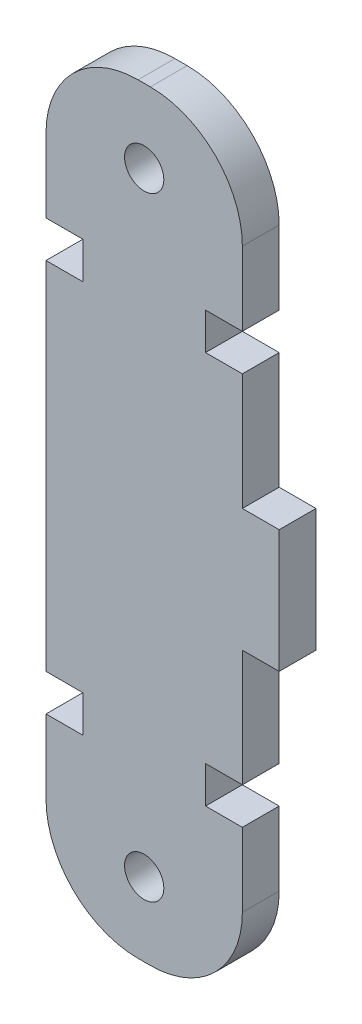
ISO-10303-21;
HEADER;
FILE_DESCRIPTION(('STEP AP214'),'2;1');
FILE_NAME('part.step','',(''),(''),'','','');
FILE_SCHEMA(('AUTOMOTIVE_DESIGN { 1 0 10303 214 1 1 1 1 }'));
ENDSEC;
DATA;
#1=APPLICATION_CONTEXT('core data for automotive mechanical design processes');
#2=APPLICATION_PROTOCOL_DEFINITION('international standard','automotive_design',2000,#1);
#3=PRODUCT_CONTEXT('',#1,'mechanical');
#4=PRODUCT('Part','Part','',(#3));
#5=PRODUCT_RELATED_PRODUCT_CATEGORY('part','',(#4));
#6=PRODUCT_DEFINITION_FORMATION('','',#4);
#7=PRODUCT_DEFINITION_CONTEXT('part definition',#1,'design');
#8=PRODUCT_DEFINITION('design','',#6,#7);
#9=PRODUCT_DEFINITION_SHAPE('','',#8);
#10=(LENGTH_UNIT() NAMED_UNIT(*) SI_UNIT(.MILLI.,.METRE.));
#11=(NAMED_UNIT(*) PLANE_ANGLE_UNIT() SI_UNIT($,.RADIAN.));
#12=(NAMED_UNIT(*) SI_UNIT($,.STERADIAN.) SOLID_ANGLE_UNIT());
#13=UNCERTAINTY_MEASURE_WITH_UNIT(LENGTH_MEASURE(1.E-05),#10,'distance_accuracy_value','');
#14=(GEOMETRIC_REPRESENTATION_CONTEXT(3) GLOBAL_UNCERTAINTY_ASSIGNED_CONTEXT((#13)) GLOBAL_UNIT_ASSIGNED_CONTEXT((#10,
#11,#12)) REPRESENTATION_CONTEXT('',''));
#15=CARTESIAN_POINT('',(0.,0.,0.));
#16=DIRECTION('',(0.,0.,1.));
#17=DIRECTION('',(1.,0.,0.));
#18=AXIS2_PLACEMENT_3D('',#15,#16,#17);
#19=CARTESIAN_POINT('',(0.,-14.5,3.));
#20=DIRECTION('',(0.,1.,0.));
#21=DIRECTION('',(0.,0.,1.));
#22=AXIS2_PLACEMENT_3D('',#19,#20,#21);
#23=PLANE('',#22);
#24=DIRECTION('',(1.,0.,0.));
#25=VECTOR('',#24,1.);
#26=CARTESIAN_POINT('',(0.,-14.5,0.));
#27=LINE('',#26,#25);
#28=CARTESIAN_POINT('',(-8.,-14.5,0.));
#29=VERTEX_POINT('',#28);
#30=CARTESIAN_POINT('',(-4.99999999999999,-14.5,0.));
#31=VERTEX_POINT('',#30);
#32=EDGE_CURVE('E237',#29,#31,#27,.T.);
#33=ORIENTED_EDGE('',*,*,#32,.T.);
#34=DIRECTION('',(0.,0.,-1.));
#35=VECTOR('',#34,1.);
#36=CARTESIAN_POINT('',(-4.99999999999999,-14.5,3.));
#37=LINE('',#36,#35);
#38=CARTESIAN_POINT('',(-4.99999999999999,-14.5,3.));
#39=VERTEX_POINT('',#38);
#40=EDGE_CURVE('E235',#39,#31,#37,.T.);
#41=ORIENTED_EDGE('',*,*,#40,.F.);
#42=DIRECTION('',(1.,0.,0.));
#43=VECTOR('',#42,1.);
#44=CARTESIAN_POINT('',(0.,-14.5,3.));
#45=LINE('',#44,#43);
#46=CARTESIAN_POINT('',(-8.,-14.5,3.));
#47=VERTEX_POINT('',#46);
#48=EDGE_CURVE('E219',#47,#39,#45,.T.);
#49=ORIENTED_EDGE('',*,*,#48,.F.);
#50=DIRECTION('',(0.,0.,-1.));
#51=VECTOR('',#50,1.);
#52=CARTESIAN_POINT('',(-8.,-14.5,3.));
#53=LINE('',#52,#51);
#54=EDGE_CURVE('E296',#47,#29,#53,.T.);
#55=ORIENTED_EDGE('',*,*,#54,.T.);
#56=EDGE_LOOP('',(#33,#41,#49,#55));
#57=FACE_BOUND('',#56,.T.);
#58=ADVANCED_FACE('F34',(#57),#23,.F.);
#59=CARTESIAN_POINT('',(-4.99999999999999,0.,3.));
#60=DIRECTION('',(-1.,0.,0.));
#61=DIRECTION('',(0.,0.,1.));
#62=AXIS2_PLACEMENT_3D('',#59,#60,#61);
#63=PLANE('',#62);
#64=DIRECTION('',(0.,1.,0.));
#65=VECTOR('',#64,1.);
#66=CARTESIAN_POINT('',(-4.99999999999999,0.,0.));
#67=LINE('',#66,#65);
#68=CARTESIAN_POINT('',(-4.99999999999999,-17.5,0.));
#69=VERTEX_POINT('',#68);
#70=EDGE_CURVE('E298',#69,#31,#67,.T.);
#71=ORIENTED_EDGE('',*,*,#70,.F.);
#72=DIRECTION('',(0.,0.,-1.));
#73=VECTOR('',#72,1.);
#74=CARTESIAN_POINT('',(-4.99999999999999,-17.5,3.));
#75=LINE('',#74,#73);
#76=CARTESIAN_POINT('',(-4.99999999999999,-17.5,3.));
#77=VERTEX_POINT('',#76);
#78=EDGE_CURVE('E242',#77,#69,#75,.T.);
#79=ORIENTED_EDGE('',*,*,#78,.F.);
#80=DIRECTION('',(0.,1.,0.));
#81=VECTOR('',#80,1.);
#82=CARTESIAN_POINT('',(-4.99999999999999,0.,3.));
#83=LINE('',#82,#81);
#84=EDGE_CURVE('E226',#77,#39,#83,.T.);
#85=ORIENTED_EDGE('',*,*,#84,.T.);
#86=ORIENTED_EDGE('',*,*,#40,.T.);
#87=EDGE_LOOP('',(#71,#79,#85,#86));
#88=FACE_BOUND('',#87,.T.);
#89=ADVANCED_FACE('F244',(#88),#63,.T.);
#90=CARTESIAN_POINT('',(0.,-17.5,3.));
#91=DIRECTION('',(0.,-1.,0.));
#92=DIRECTION('',(0.,0.,-1.));
#93=AXIS2_PLACEMENT_3D('',#90,#91,#92);
#94=PLANE('',#93);
#95=DIRECTION('',(-1.,0.,0.));
#96=VECTOR('',#95,1.);
#97=CARTESIAN_POINT('',(0.,-17.5,0.));
#98=LINE('',#97,#96);
#99=CARTESIAN_POINT('',(-8.,-17.5,0.));
#100=VERTEX_POINT('',#99);
#101=EDGE_CURVE('E301',#69,#100,#98,.T.);
#102=ORIENTED_EDGE('',*,*,#101,.T.);
#103=DIRECTION('',(0.,0.,-1.));
#104=VECTOR('',#103,1.);
#105=CARTESIAN_POINT('',(-8.,-17.5,3.));
#106=LINE('',#105,#104);
#107=CARTESIAN_POINT('',(-8.,-17.5,3.));
#108=VERTEX_POINT('',#107);
#109=EDGE_CURVE('E394',#108,#100,#106,.T.);
#110=ORIENTED_EDGE('',*,*,#109,.F.);
#111=DIRECTION('',(-1.,0.,0.));
#112=VECTOR('',#111,1.);
#113=CARTESIAN_POINT('',(0.,-17.5,3.));
#114=LINE('',#113,#112);
#115=EDGE_CURVE('E246',#77,#108,#114,.T.);
#116=ORIENTED_EDGE('',*,*,#115,.F.);
#117=ORIENTED_EDGE('',*,*,#78,.T.);
#118=EDGE_LOOP('',(#102,#110,#116,#117));
#119=FACE_BOUND('',#118,.T.);
#120=ADVANCED_FACE('F466',(#119),#94,.F.);
#121=CARTESIAN_POINT('',(-8.,0.,3.));
#122=DIRECTION('',(-1.,0.,0.));
#123=DIRECTION('',(0.,0.,1.));
#124=AXIS2_PLACEMENT_3D('',#121,#122,#123);
#125=PLANE('',#124);
#126=DIRECTION('',(0.,1.,0.));
#127=VECTOR('',#126,1.);
#128=CARTESIAN_POINT('',(-8.,0.,0.));
#129=LINE('',#128,#127);
#130=CARTESIAN_POINT('',(-8.,-23.5,0.));
#131=VERTEX_POINT('',#130);
#132=EDGE_CURVE('E304',#131,#100,#129,.T.);
#133=ORIENTED_EDGE('',*,*,#132,.F.);
#134=DIRECTION('',(0.,0.,-1.));
#135=VECTOR('',#134,1.);
#136=CARTESIAN_POINT('',(-8.,-23.5,3.));
#137=LINE('',#136,#135);
#138=CARTESIAN_POINT('',(-8.,-23.5,3.));
#139=VERTEX_POINT('',#138);
#140=EDGE_CURVE('E410',#131,#139,#137,.F.);
#141=ORIENTED_EDGE('',*,*,#140,.T.);
#142=DIRECTION('',(0.,1.,0.));
#143=VECTOR('',#142,1.);
#144=CARTESIAN_POINT('',(-8.,0.,3.));
#145=LINE('',#144,#143);
#146=EDGE_CURVE('E248',#139,#108,#145,.T.);
#147=ORIENTED_EDGE('',*,*,#146,.T.);
#148=ORIENTED_EDGE('',*,*,#109,.T.);
#149=EDGE_LOOP('',(#133,#141,#147,#148));
#150=FACE_BOUND('',#149,.T.);
#151=ADVANCED_FACE('F576',(#150),#125,.T.);
#152=CARTESIAN_POINT('',(0.,-31.,3.));
#153=DIRECTION('',(0.,-1.,0.));
#154=DIRECTION('',(1.,0.,0.));
#155=AXIS2_PLACEMENT_3D('',#152,#153,#154);
#156=PLANE('',#155);
#157=DIRECTION('',(-1.,0.,0.));
#158=VECTOR('',#157,1.);
#159=CARTESIAN_POINT('',(0.,-31.,3.));
#160=LINE('',#159,#158);
#161=CARTESIAN_POINT('',(0.499999999999998,-31.,3.));
#162=VERTEX_POINT('',#161);
#163=CARTESIAN_POINT('',(-0.5,-31.,3.));
#164=VERTEX_POINT('',#163);
#165=EDGE_CURVE('E253',#162,#164,#160,.T.);
#166=ORIENTED_EDGE('',*,*,#165,.T.);
#167=DIRECTION('',(0.,0.,-1.));
#168=VECTOR('',#167,1.);
#169=CARTESIAN_POINT('',(-0.5,-31.,3.));
#170=LINE('',#169,#168);
#171=CARTESIAN_POINT('',(-0.5,-31.,0.));
#172=VERTEX_POINT('',#171);
#173=EDGE_CURVE('E399',#164,#172,#170,.T.);
#174=ORIENTED_EDGE('',*,*,#173,.T.);
#175=DIRECTION('',(-1.,0.,0.));
#176=VECTOR('',#175,1.);
#177=CARTESIAN_POINT('',(0.,-31.,0.));
#178=LINE('',#177,#176);
#179=CARTESIAN_POINT('',(0.499999999999998,-31.,0.));
#180=VERTEX_POINT('',#179);
#181=EDGE_CURVE('E307',#180,#172,#178,.T.);
#182=ORIENTED_EDGE('',*,*,#181,.F.);
#183=DIRECTION('',(0.,0.,-1.));
#184=VECTOR('',#183,1.);
#185=CARTESIAN_POINT('',(0.499999999999998,-31.,3.));
#186=LINE('',#185,#184);
#187=EDGE_CURVE('E241',#180,#162,#186,.F.);
#188=ORIENTED_EDGE('',*,*,#187,.T.);
#189=EDGE_LOOP('',(#166,#174,#182,#188));
#190=FACE_BOUND('',#189,.T.);
#191=ADVANCED_FACE('F476',(#190),#156,.T.);
#192=CARTESIAN_POINT('',(8.,0.,3.));
#193=DIRECTION('',(-1.,0.,0.));
#194=DIRECTION('',(0.,-1.,0.));
#195=AXIS2_PLACEMENT_3D('',#192,#193,#194);
#196=PLANE('',#195);
#197=DIRECTION('',(0.,1.,0.));
#198=VECTOR('',#197,1.);
#199=CARTESIAN_POINT('',(8.,0.,3.));
#200=LINE('',#199,#198);
#201=CARTESIAN_POINT('',(8.,-23.5,3.));
#202=VERTEX_POINT('',#201);
#203=CARTESIAN_POINT('',(8.,-17.5,3.));
#204=VERTEX_POINT('',#203);
#205=EDGE_CURVE('E256',#202,#204,#200,.T.);
#206=ORIENTED_EDGE('',*,*,#205,.F.);
#207=DIRECTION('',(0.,0.,-1.));
#208=VECTOR('',#207,1.);
#209=CARTESIAN_POINT('',(8.,-23.5,0.));
#210=LINE('',#209,#208);
#211=CARTESIAN_POINT('',(8.,-23.5,0.));
#212=VERTEX_POINT('',#211);
#213=EDGE_CURVE('E419',#202,#212,#210,.T.);
#214=ORIENTED_EDGE('',*,*,#213,.T.);
#215=DIRECTION('',(0.,1.,0.));
#216=VECTOR('',#215,1.);
#217=CARTESIAN_POINT('',(8.,0.,0.));
#218=LINE('',#217,#216);
#219=CARTESIAN_POINT('',(8.,-17.5,0.));
#220=VERTEX_POINT('',#219);
#221=EDGE_CURVE('E310',#212,#220,#218,.T.);
#222=ORIENTED_EDGE('',*,*,#221,.T.);
#223=DIRECTION('',(0.,0.,-1.));
#224=VECTOR('',#223,1.);
#225=CARTESIAN_POINT('',(8.,-17.5,3.));
#226=LINE('',#225,#224);
#227=EDGE_CURVE('E391',#204,#220,#226,.T.);
#228=ORIENTED_EDGE('',*,*,#227,.F.);
#229=EDGE_LOOP('',(#206,#214,#222,#228));
#230=FACE_BOUND('',#229,.T.);
#231=ADVANCED_FACE('F486',(#230),#196,.F.);
#232=CARTESIAN_POINT('',(5.00000000000001,-17.5,0.));
#233=VERTEX_POINT('',#232);
#234=EDGE_CURVE('E305',#220,#233,#98,.T.);
#235=ORIENTED_EDGE('',*,*,#234,.T.);
#236=DIRECTION('',(0.,0.,-1.));
#237=VECTOR('',#236,1.);
#238=CARTESIAN_POINT('',(5.00000000000001,-17.5,3.));
#239=LINE('',#238,#237);
#240=CARTESIAN_POINT('',(5.00000000000001,-17.5,3.));
#241=VERTEX_POINT('',#240);
#242=EDGE_CURVE('E388',#241,#233,#239,.T.);
#243=ORIENTED_EDGE('',*,*,#242,.F.);
#244=EDGE_CURVE('E250',#204,#241,#114,.T.);
#245=ORIENTED_EDGE('',*,*,#244,.F.);
#246=ORIENTED_EDGE('',*,*,#227,.T.);
#247=EDGE_LOOP('',(#235,#243,#245,#246));
#248=FACE_BOUND('',#247,.T.);
#249=ADVANCED_FACE('F493',(#248),#94,.F.);
#250=CARTESIAN_POINT('',(5.,0.,3.));
#251=DIRECTION('',(-1.,0.,0.));
#252=DIRECTION('',(0.,-1.,0.));
#253=AXIS2_PLACEMENT_3D('',#250,#251,#252);
#254=PLANE('',#253);
#255=DIRECTION('',(0.,1.,0.));
#256=VECTOR('',#255,1.);
#257=CARTESIAN_POINT('',(5.,0.,0.));
#258=LINE('',#257,#256);
#259=CARTESIAN_POINT('',(5.00000000000001,-14.5,0.));
#260=VERTEX_POINT('',#259);
#261=EDGE_CURVE('E312',#233,#260,#258,.T.);
#262=ORIENTED_EDGE('',*,*,#261,.T.);
#263=DIRECTION('',(0.,0.,-1.));
#264=VECTOR('',#263,1.);
#265=CARTESIAN_POINT('',(5.00000000000001,-14.5,3.));
#266=LINE('',#265,#264);
#267=CARTESIAN_POINT('',(5.00000000000001,-14.5,3.));
#268=VERTEX_POINT('',#267);
#269=EDGE_CURVE('E385',#268,#260,#266,.T.);
#270=ORIENTED_EDGE('',*,*,#269,.F.);
#271=DIRECTION('',(0.,1.,0.));
#272=VECTOR('',#271,1.);
#273=CARTESIAN_POINT('',(5.,0.,3.));
#274=LINE('',#273,#272);
#275=EDGE_CURVE('E258',#241,#268,#274,.T.);
#276=ORIENTED_EDGE('',*,*,#275,.F.);
#277=ORIENTED_EDGE('',*,*,#242,.T.);
#278=EDGE_LOOP('',(#262,#270,#276,#277));
#279=FACE_BOUND('',#278,.T.);
#280=ADVANCED_FACE('F496',(#279),#254,.F.);
#281=CARTESIAN_POINT('',(8.,-14.5,0.));
#282=VERTEX_POINT('',#281);
#283=EDGE_CURVE('E299',#260,#282,#27,.T.);
#284=ORIENTED_EDGE('',*,*,#283,.T.);
#285=DIRECTION('',(0.,0.,-1.));
#286=VECTOR('',#285,1.);
#287=CARTESIAN_POINT('',(8.,-14.5,3.));
#288=LINE('',#287,#286);
#289=CARTESIAN_POINT('',(8.,-14.5,3.));
#290=VERTEX_POINT('',#289);
#291=EDGE_CURVE('E382',#290,#282,#288,.T.);
#292=ORIENTED_EDGE('',*,*,#291,.F.);
#293=EDGE_CURVE('E233',#268,#290,#45,.T.);
#294=ORIENTED_EDGE('',*,*,#293,.F.);
#295=ORIENTED_EDGE('',*,*,#269,.T.);
#296=EDGE_LOOP('',(#284,#292,#294,#295));
#297=FACE_BOUND('',#296,.T.);
#298=ADVANCED_FACE('F501',(#297),#23,.F.);
#299=CARTESIAN_POINT('',(8.,0.,3.));
#300=DIRECTION('',(-1.,0.,0.));
#301=DIRECTION('',(0.,0.,1.));
#302=AXIS2_PLACEMENT_3D('',#299,#300,#301);
#303=PLANE('',#302);
#304=DIRECTION('',(0.,1.,0.));
#305=VECTOR('',#304,1.);
#306=CARTESIAN_POINT('',(8.,0.,0.));
#307=LINE('',#306,#305);
#308=CARTESIAN_POINT('',(8.,-4.99999999999999,0.));
#309=VERTEX_POINT('',#308);
#310=EDGE_CURVE('E314',#282,#309,#307,.T.);
#311=ORIENTED_EDGE('',*,*,#310,.T.);
#312=DIRECTION('',(0.,0.,-1.));
#313=VECTOR('',#312,1.);
#314=CARTESIAN_POINT('',(8.,-4.99999999999999,3.));
#315=LINE('',#314,#313);
#316=CARTESIAN_POINT('',(8.,-4.99999999999999,3.));
#317=VERTEX_POINT('',#316);
#318=EDGE_CURVE('E380',#317,#309,#315,.T.);
#319=ORIENTED_EDGE('',*,*,#318,.F.);
#320=DIRECTION('',(0.,1.,0.));
#321=VECTOR('',#320,1.);
#322=CARTESIAN_POINT('',(8.,0.,3.));
#323=LINE('',#322,#321);
#324=EDGE_CURVE('E260',#290,#317,#323,.T.);
#325=ORIENTED_EDGE('',*,*,#324,.F.);
#326=ORIENTED_EDGE('',*,*,#291,.T.);
#327=EDGE_LOOP('',(#311,#319,#325,#326));
#328=FACE_BOUND('',#327,.T.);
#329=ADVANCED_FACE('F506',(#328),#303,.F.);
#330=CARTESIAN_POINT('',(0.,-4.99999999999999,3.));
#331=DIRECTION('',(0.,-1.,0.));
#332=DIRECTION('',(1.,0.,0.));
#333=AXIS2_PLACEMENT_3D('',#330,#331,#332);
#334=PLANE('',#333);
#335=DIRECTION('',(-1.,0.,0.));
#336=VECTOR('',#335,1.);
#337=CARTESIAN_POINT('',(0.,-4.99999999999999,0.));
#338=LINE('',#337,#336);
#339=CARTESIAN_POINT('',(11.,-4.99999999999999,0.));
#340=VERTEX_POINT('',#339);
#341=EDGE_CURVE('E317',#340,#309,#338,.T.);
#342=ORIENTED_EDGE('',*,*,#341,.F.);
#343=DIRECTION('',(0.,0.,-1.));
#344=VECTOR('',#343,1.);
#345=CARTESIAN_POINT('',(11.,-4.99999999999999,3.));
#346=LINE('',#345,#344);
#347=CARTESIAN_POINT('',(11.,-4.99999999999999,3.));
#348=VERTEX_POINT('',#347);
#349=EDGE_CURVE('E378',#348,#340,#346,.T.);
#350=ORIENTED_EDGE('',*,*,#349,.F.);
#351=DIRECTION('',(-1.,0.,0.));
#352=VECTOR('',#351,1.);
#353=CARTESIAN_POINT('',(0.,-4.99999999999999,3.));
#354=LINE('',#353,#352);
#355=EDGE_CURVE('E262',#348,#317,#354,.T.);
#356=ORIENTED_EDGE('',*,*,#355,.T.);
#357=ORIENTED_EDGE('',*,*,#318,.T.);
#358=EDGE_LOOP('',(#342,#350,#356,#357));
#359=FACE_BOUND('',#358,.T.);
#360=ADVANCED_FACE('F510',(#359),#334,.T.);
#361=CARTESIAN_POINT('',(11.,0.,3.));
#362=DIRECTION('',(-1.,0.,0.));
#363=DIRECTION('',(0.,-1.,0.));
#364=AXIS2_PLACEMENT_3D('',#361,#362,#363);
#365=PLANE('',#364);
#366=DIRECTION('',(0.,1.,0.));
#367=VECTOR('',#366,1.);
#368=CARTESIAN_POINT('',(11.,0.,0.));
#369=LINE('',#368,#367);
#370=CARTESIAN_POINT('',(11.,5.00000000000001,0.));
#371=VERTEX_POINT('',#370);
#372=EDGE_CURVE('E321',#340,#371,#369,.T.);
#373=ORIENTED_EDGE('',*,*,#372,.T.);
#374=DIRECTION('',(0.,0.,-1.));
#375=VECTOR('',#374,1.);
#376=CARTESIAN_POINT('',(11.,5.00000000000001,3.));
#377=LINE('',#376,#375);
#378=CARTESIAN_POINT('',(11.,5.00000000000001,3.));
#379=VERTEX_POINT('',#378);
#380=EDGE_CURVE('E375',#379,#371,#377,.T.);
#381=ORIENTED_EDGE('',*,*,#380,.F.);
#382=DIRECTION('',(0.,1.,0.));
#383=VECTOR('',#382,1.);
#384=CARTESIAN_POINT('',(11.,0.,3.));
#385=LINE('',#384,#383);
#386=EDGE_CURVE('E266',#348,#379,#385,.T.);
#387=ORIENTED_EDGE('',*,*,#386,.F.);
#388=ORIENTED_EDGE('',*,*,#349,.T.);
#389=EDGE_LOOP('',(#373,#381,#387,#388));
#390=FACE_BOUND('',#389,.T.);
#391=ADVANCED_FACE('F515',(#390),#365,.F.);
#392=CARTESIAN_POINT('',(0.,5.00000000000001,3.));
#393=DIRECTION('',(0.,-1.,0.));
#394=DIRECTION('',(0.,0.,-1.));
#395=AXIS2_PLACEMENT_3D('',#392,#393,#394);
#396=PLANE('',#395);
#397=DIRECTION('',(-1.,0.,0.));
#398=VECTOR('',#397,1.);
#399=CARTESIAN_POINT('',(0.,5.00000000000001,0.));
#400=LINE('',#399,#398);
#401=CARTESIAN_POINT('',(8.,5.00000000000001,0.));
#402=VERTEX_POINT('',#401);
#403=EDGE_CURVE('E323',#371,#402,#400,.T.);
#404=ORIENTED_EDGE('',*,*,#403,.T.);
#405=DIRECTION('',(0.,0.,-1.));
#406=VECTOR('',#405,1.);
#407=CARTESIAN_POINT('',(8.,5.00000000000001,3.));
#408=LINE('',#407,#406);
#409=CARTESIAN_POINT('',(8.,5.00000000000001,3.));
#410=VERTEX_POINT('',#409);
#411=EDGE_CURVE('E372',#410,#402,#408,.T.);
#412=ORIENTED_EDGE('',*,*,#411,.F.);
#413=DIRECTION('',(-1.,0.,0.));
#414=VECTOR('',#413,1.);
#415=CARTESIAN_POINT('',(0.,5.00000000000001,3.));
#416=LINE('',#415,#414);
#417=EDGE_CURVE('E268',#379,#410,#416,.T.);
#418=ORIENTED_EDGE('',*,*,#417,.F.);
#419=ORIENTED_EDGE('',*,*,#380,.T.);
#420=EDGE_LOOP('',(#404,#412,#418,#419));
#421=FACE_BOUND('',#420,.T.);
#422=ADVANCED_FACE('F522',(#421),#396,.F.);
#423=CARTESIAN_POINT('',(8.,14.5,0.));
#424=VERTEX_POINT('',#423);
#425=EDGE_CURVE('E318',#402,#424,#307,.T.);
#426=ORIENTED_EDGE('',*,*,#425,.T.);
#427=DIRECTION('',(0.,0.,-1.));
#428=VECTOR('',#427,1.);
#429=CARTESIAN_POINT('',(8.,14.5,3.));
#430=LINE('',#429,#428);
#431=CARTESIAN_POINT('',(8.,14.5,3.));
#432=VERTEX_POINT('',#431);
#433=EDGE_CURVE('E370',#432,#424,#430,.T.);
#434=ORIENTED_EDGE('',*,*,#433,.F.);
#435=EDGE_CURVE('E263',#410,#432,#323,.T.);
#436=ORIENTED_EDGE('',*,*,#435,.F.);
#437=ORIENTED_EDGE('',*,*,#411,.T.);
#438=EDGE_LOOP('',(#426,#434,#436,#437));
#439=FACE_BOUND('',#438,.T.);
#440=ADVANCED_FACE('F527',(#439),#303,.F.);
#441=CARTESIAN_POINT('',(0.,14.5,3.));
#442=DIRECTION('',(0.,1.,0.));
#443=DIRECTION('',(0.,0.,1.));
#444=AXIS2_PLACEMENT_3D('',#441,#442,#443);
#445=PLANE('',#444);
#446=DIRECTION('',(1.,0.,0.));
#447=VECTOR('',#446,1.);
#448=CARTESIAN_POINT('',(0.,14.5,0.));
#449=LINE('',#448,#447);
#450=CARTESIAN_POINT('',(5.,14.5,0.));
#451=VERTEX_POINT('',#450);
#452=EDGE_CURVE('E325',#451,#424,#449,.T.);
#453=ORIENTED_EDGE('',*,*,#452,.F.);
#454=DIRECTION('',(0.,0.,-1.));
#455=VECTOR('',#454,1.);
#456=CARTESIAN_POINT('',(5.,14.5,3.));
#457=LINE('',#456,#455);
#458=CARTESIAN_POINT('',(5.,14.5,3.));
#459=VERTEX_POINT('',#458);
#460=EDGE_CURVE('E368',#459,#451,#457,.T.);
#461=ORIENTED_EDGE('',*,*,#460,.F.);
#462=DIRECTION('',(1.,0.,0.));
#463=VECTOR('',#462,1.);
#464=CARTESIAN_POINT('',(0.,14.5,3.));
#465=LINE('',#464,#463);
#466=EDGE_CURVE('E270',#459,#432,#465,.T.);
#467=ORIENTED_EDGE('',*,*,#466,.T.);
#468=ORIENTED_EDGE('',*,*,#433,.T.);
#469=EDGE_LOOP('',(#453,#461,#467,#468));
#470=FACE_BOUND('',#469,.T.);
#471=ADVANCED_FACE('F530',(#470),#445,.T.);
#472=CARTESIAN_POINT('',(4.99999999999999,0.,3.));
#473=DIRECTION('',(1.,0.,0.));
#474=DIRECTION('',(0.,1.,0.));
#475=AXIS2_PLACEMENT_3D('',#472,#473,#474);
#476=PLANE('',#475);
#477=DIRECTION('',(0.,-1.,0.));
#478=VECTOR('',#477,1.);
#479=CARTESIAN_POINT('',(4.99999999999999,0.,0.));
#480=LINE('',#479,#478);
#481=CARTESIAN_POINT('',(5.,17.5,0.));
#482=VERTEX_POINT('',#481);
#483=EDGE_CURVE('E328',#482,#451,#480,.T.);
#484=ORIENTED_EDGE('',*,*,#483,.F.);
#485=DIRECTION('',(0.,0.,-1.));
#486=VECTOR('',#485,1.);
#487=CARTESIAN_POINT('',(5.,17.5,3.));
#488=LINE('',#487,#486);
#489=CARTESIAN_POINT('',(5.,17.5,3.));
#490=VERTEX_POINT('',#489);
#491=EDGE_CURVE('E366',#490,#482,#488,.T.);
#492=ORIENTED_EDGE('',*,*,#491,.F.);
#493=DIRECTION('',(0.,-1.,0.));
#494=VECTOR('',#493,1.);
#495=CARTESIAN_POINT('',(4.99999999999999,0.,3.));
#496=LINE('',#495,#494);
#497=EDGE_CURVE('E273',#490,#459,#496,.T.);
#498=ORIENTED_EDGE('',*,*,#497,.T.);
#499=ORIENTED_EDGE('',*,*,#460,.T.);
#500=EDGE_LOOP('',(#484,#492,#498,#499));
#501=FACE_BOUND('',#500,.T.);
#502=ADVANCED_FACE('F535',(#501),#476,.T.);
#503=CARTESIAN_POINT('',(0.,17.5,3.));
#504=DIRECTION('',(0.,-1.,0.));
#505=DIRECTION('',(0.,0.,-1.));
#506=AXIS2_PLACEMENT_3D('',#503,#504,#505);
#507=PLANE('',#506);
#508=DIRECTION('',(-1.,0.,0.));
#509=VECTOR('',#508,1.);
#510=CARTESIAN_POINT('',(0.,17.5,0.));
#511=LINE('',#510,#509);
#512=CARTESIAN_POINT('',(8.,17.5,0.));
#513=VERTEX_POINT('',#512);
#514=EDGE_CURVE('E332',#513,#482,#511,.T.);
#515=ORIENTED_EDGE('',*,*,#514,.F.);
#516=DIRECTION('',(0.,0.,-1.));
#517=VECTOR('',#516,1.);
#518=CARTESIAN_POINT('',(8.,17.5,3.));
#519=LINE('',#518,#517);
#520=CARTESIAN_POINT('',(8.,17.5,3.));
#521=VERTEX_POINT('',#520);
#522=EDGE_CURVE('E363',#521,#513,#519,.T.);
#523=ORIENTED_EDGE('',*,*,#522,.F.);
#524=DIRECTION('',(-1.,0.,0.));
#525=VECTOR('',#524,1.);
#526=CARTESIAN_POINT('',(0.,17.5,3.));
#527=LINE('',#526,#525);
#528=EDGE_CURVE('E277',#521,#490,#527,.T.);
#529=ORIENTED_EDGE('',*,*,#528,.T.);
#530=ORIENTED_EDGE('',*,*,#491,.T.);
#531=EDGE_LOOP('',(#515,#523,#529,#530));
#532=FACE_BOUND('',#531,.T.);
#533=ADVANCED_FACE('F538',(#532),#507,.T.);
#534=CARTESIAN_POINT('',(8.,0.,3.));
#535=DIRECTION('',(1.,0.,0.));
#536=DIRECTION('',(0.,1.,0.));
#537=AXIS2_PLACEMENT_3D('',#534,#535,#536);
#538=PLANE('',#537);
#539=DIRECTION('',(0.,-1.,0.));
#540=VECTOR('',#539,1.);
#541=CARTESIAN_POINT('',(8.,0.,0.));
#542=LINE('',#541,#540);
#543=CARTESIAN_POINT('',(8.,23.5,0.));
#544=VERTEX_POINT('',#543);
#545=EDGE_CURVE('E335',#544,#513,#542,.T.);
#546=ORIENTED_EDGE('',*,*,#545,.F.);
#547=DIRECTION('',(0.,0.,-1.));
#548=VECTOR('',#547,1.);
#549=CARTESIAN_POINT('',(8.,23.5,3.));
#550=LINE('',#549,#548);
#551=CARTESIAN_POINT('',(8.,23.5,3.));
#552=VERTEX_POINT('',#551);
#553=EDGE_CURVE('E11',#544,#552,#550,.F.);
#554=ORIENTED_EDGE('',*,*,#553,.T.);
#555=DIRECTION('',(0.,-1.,0.));
#556=VECTOR('',#555,1.);
#557=CARTESIAN_POINT('',(8.,0.,3.));
#558=LINE('',#557,#556);
#559=EDGE_CURVE('E280',#552,#521,#558,.T.);
#560=ORIENTED_EDGE('',*,*,#559,.T.);
#561=ORIENTED_EDGE('',*,*,#522,.T.);
#562=EDGE_LOOP('',(#546,#554,#560,#561));
#563=FACE_BOUND('',#562,.T.);
#564=ADVANCED_FACE('F543',(#563),#538,.T.);
#565=CARTESIAN_POINT('',(0.,31.,3.));
#566=DIRECTION('',(0.,-1.,0.));
#567=DIRECTION('',(1.,0.,0.));
#568=AXIS2_PLACEMENT_3D('',#565,#566,#567);
#569=PLANE('',#568);
#570=DIRECTION('',(-1.,0.,0.));
#571=VECTOR('',#570,1.);
#572=CARTESIAN_POINT('',(0.,31.,0.));
#573=LINE('',#572,#571);
#574=CARTESIAN_POINT('',(0.499999999999998,31.,0.));
#575=VERTEX_POINT('',#574);
#576=CARTESIAN_POINT('',(-0.5,31.,0.));
#577=VERTEX_POINT('',#576);
#578=EDGE_CURVE('E338',#575,#577,#573,.T.);
#579=ORIENTED_EDGE('',*,*,#578,.T.);
#580=DIRECTION('',(0.,0.,-1.));
#581=VECTOR('',#580,1.);
#582=CARTESIAN_POINT('',(-0.5,31.,3.));
#583=LINE('',#582,#581);
#584=CARTESIAN_POINT('',(-0.5,31.,3.));
#585=VERTEX_POINT('',#584);
#586=EDGE_CURVE('E42',#577,#585,#583,.F.);
#587=ORIENTED_EDGE('',*,*,#586,.T.);
#588=DIRECTION('',(-1.,0.,0.));
#589=VECTOR('',#588,1.);
#590=CARTESIAN_POINT('',(0.,31.,3.));
#591=LINE('',#590,#589);
#592=CARTESIAN_POINT('',(0.499999999999998,31.,3.));
#593=VERTEX_POINT('',#592);
#594=EDGE_CURVE('E283',#593,#585,#591,.T.);
#595=ORIENTED_EDGE('',*,*,#594,.F.);
#596=DIRECTION('',(0.,0.,-1.));
#597=VECTOR('',#596,1.);
#598=CARTESIAN_POINT('',(0.499999999999998,31.,0.));
#599=LINE('',#598,#597);
#600=EDGE_CURVE('E425',#593,#575,#599,.T.);
#601=ORIENTED_EDGE('',*,*,#600,.T.);
#602=EDGE_LOOP('',(#579,#587,#595,#601));
#603=FACE_BOUND('',#602,.T.);
#604=ADVANCED_FACE('F429',(#603),#569,.F.);
#605=CARTESIAN_POINT('',(-8.,0.,3.));
#606=DIRECTION('',(1.,0.,0.));
#607=DIRECTION('',(0.,0.,-1.));
#608=AXIS2_PLACEMENT_3D('',#605,#606,#607);
#609=PLANE('',#608);
#610=DIRECTION('',(0.,-1.,0.));
#611=VECTOR('',#610,1.);
#612=CARTESIAN_POINT('',(-8.,0.,3.));
#613=LINE('',#612,#611);
#614=CARTESIAN_POINT('',(-8.,23.5,3.));
#615=VERTEX_POINT('',#614);
#616=CARTESIAN_POINT('',(-8.,17.5,3.));
#617=VERTEX_POINT('',#616);
#618=EDGE_CURVE('E285',#615,#617,#613,.T.);
#619=ORIENTED_EDGE('',*,*,#618,.F.);
#620=DIRECTION('',(0.,0.,-1.));
#621=VECTOR('',#620,1.);
#622=CARTESIAN_POINT('',(-8.,23.5,3.));
#623=LINE('',#622,#621);
#624=CARTESIAN_POINT('',(-8.,23.5,0.));
#625=VERTEX_POINT('',#624);
#626=EDGE_CURVE('E422',#615,#625,#623,.T.);
#627=ORIENTED_EDGE('',*,*,#626,.T.);
#628=DIRECTION('',(0.,-1.,0.));
#629=VECTOR('',#628,1.);
#630=CARTESIAN_POINT('',(-8.,0.,0.));
#631=LINE('',#630,#629);
#632=CARTESIAN_POINT('',(-8.,17.5,0.));
#633=VERTEX_POINT('',#632);
#634=EDGE_CURVE('E340',#625,#633,#631,.T.);
#635=ORIENTED_EDGE('',*,*,#634,.T.);
#636=DIRECTION('',(0.,0.,-1.));
#637=VECTOR('',#636,1.);
#638=CARTESIAN_POINT('',(-8.,17.5,3.));
#639=LINE('',#638,#637);
#640=EDGE_CURVE('E360',#617,#633,#639,.T.);
#641=ORIENTED_EDGE('',*,*,#640,.F.);
#642=EDGE_LOOP('',(#619,#627,#635,#641));
#643=FACE_BOUND('',#642,.T.);
#644=ADVANCED_FACE('F442',(#643),#609,.F.);
#645=CARTESIAN_POINT('',(-5.,17.5,0.));
#646=VERTEX_POINT('',#645);
#647=EDGE_CURVE('E336',#646,#633,#511,.T.);
#648=ORIENTED_EDGE('',*,*,#647,.F.);
#649=DIRECTION('',(0.,0.,-1.));
#650=VECTOR('',#649,1.);
#651=CARTESIAN_POINT('',(-5.,17.5,3.));
#652=LINE('',#651,#650);
#653=CARTESIAN_POINT('',(-5.,17.5,3.));
#654=VERTEX_POINT('',#653);
#655=EDGE_CURVE('E358',#654,#646,#652,.T.);
#656=ORIENTED_EDGE('',*,*,#655,.F.);
#657=EDGE_CURVE('E281',#654,#617,#527,.T.);
#658=ORIENTED_EDGE('',*,*,#657,.T.);
#659=ORIENTED_EDGE('',*,*,#640,.T.);
#660=EDGE_LOOP('',(#648,#656,#658,#659));
#661=FACE_BOUND('',#660,.T.);
#662=ADVANCED_FACE('F450',(#661),#507,.T.);
#663=CARTESIAN_POINT('',(-5.,0.,3.));
#664=DIRECTION('',(1.,0.,0.));
#665=DIRECTION('',(0.,0.,-1.));
#666=AXIS2_PLACEMENT_3D('',#663,#664,#665);
#667=PLANE('',#666);
#668=DIRECTION('',(0.,-1.,0.));
#669=VECTOR('',#668,1.);
#670=CARTESIAN_POINT('',(-5.,0.,0.));
#671=LINE('',#670,#669);
#672=CARTESIAN_POINT('',(-5.,14.5,0.));
#673=VERTEX_POINT('',#672);
#674=EDGE_CURVE('E342',#646,#673,#671,.T.);
#675=ORIENTED_EDGE('',*,*,#674,.T.);
#676=DIRECTION('',(0.,0.,-1.));
#677=VECTOR('',#676,1.);
#678=CARTESIAN_POINT('',(-5.,14.5,3.));
#679=LINE('',#678,#677);
#680=CARTESIAN_POINT('',(-5.,14.5,3.));
#681=VERTEX_POINT('',#680);
#682=EDGE_CURVE('E356',#681,#673,#679,.T.);
#683=ORIENTED_EDGE('',*,*,#682,.F.);
#684=DIRECTION('',(0.,-1.,0.));
#685=VECTOR('',#684,1.);
#686=CARTESIAN_POINT('',(-5.,0.,3.));
#687=LINE('',#686,#685);
#688=EDGE_CURVE('E287',#654,#681,#687,.T.);
#689=ORIENTED_EDGE('',*,*,#688,.F.);
#690=ORIENTED_EDGE('',*,*,#655,.T.);
#691=EDGE_LOOP('',(#675,#683,#689,#690));
#692=FACE_BOUND('',#691,.T.);
#693=ADVANCED_FACE('F453',(#692),#667,.F.);
#694=CARTESIAN_POINT('',(-8.,14.5,0.));
#695=VERTEX_POINT('',#694);
#696=EDGE_CURVE('E329',#695,#673,#449,.T.);
#697=ORIENTED_EDGE('',*,*,#696,.F.);
#698=DIRECTION('',(0.,0.,-1.));
#699=VECTOR('',#698,1.);
#700=CARTESIAN_POINT('',(-8.,14.5,3.));
#701=LINE('',#700,#699);
#702=CARTESIAN_POINT('',(-8.,14.5,3.));
#703=VERTEX_POINT('',#702);
#704=EDGE_CURVE('E354',#703,#695,#701,.T.);
#705=ORIENTED_EDGE('',*,*,#704,.F.);
#706=EDGE_CURVE('E274',#703,#681,#465,.T.);
#707=ORIENTED_EDGE('',*,*,#706,.T.);
#708=ORIENTED_EDGE('',*,*,#682,.T.);
#709=EDGE_LOOP('',(#697,#705,#707,#708));
#710=FACE_BOUND('',#709,.T.);
#711=ADVANCED_FACE('F458',(#710),#445,.T.);
#712=CARTESIAN_POINT('',(0.,25.,3.));
#713=DIRECTION('',(0.,0.,-1.));
#714=DIRECTION('',(-1.,0.,0.));
#715=AXIS2_PLACEMENT_3D('',#712,#713,#714);
#716=CYLINDRICAL_SURFACE('',#715,1.6);
#717=CARTESIAN_POINT('',(0.,25.,3.));
#718=DIRECTION('',(0.,0.,1.));
#719=DIRECTION('',(1.,0.,0.));
#720=AXIS2_PLACEMENT_3D('',#717,#718,#719);
#721=CIRCLE('',#720,1.6);
#722=CARTESIAN_POINT('',(1.6,25.,3.));
#723=VERTEX_POINT('',#722);
#724=EDGE_CURVE('E290',#723,#723,#721,.T.);
#725=ORIENTED_EDGE('',*,*,#724,.T.);
#726=EDGE_LOOP('',(#725));
#727=FACE_BOUND('',#726,.T.);
#728=CARTESIAN_POINT('',(0.,25.,0.));
#729=DIRECTION('',(0.,0.,1.));
#730=DIRECTION('',(1.,0.,0.));
#731=AXIS2_PLACEMENT_3D('',#728,#729,#730);
#732=CIRCLE('',#731,1.6);
#733=CARTESIAN_POINT('',(1.6,25.,0.));
#734=VERTEX_POINT('',#733);
#735=EDGE_CURVE('E348',#734,#734,#732,.T.);
#736=ORIENTED_EDGE('',*,*,#735,.F.);
#737=EDGE_LOOP('',(#736));
#738=FACE_BOUND('',#737,.T.);
#739=ADVANCED_FACE('F685',(#727,#738),#716,.F.);
#740=CARTESIAN_POINT('',(-8.,0.,3.));
#741=DIRECTION('',(-1.,0.,0.));
#742=DIRECTION('',(0.,0.,1.));
#743=AXIS2_PLACEMENT_3D('',#740,#741,#742);
#744=PLANE('',#743);
#745=DIRECTION('',(0.,1.,0.));
#746=VECTOR('',#745,1.);
#747=CARTESIAN_POINT('',(-8.,0.,0.));
#748=LINE('',#747,#746);
#749=EDGE_CURVE('E345',#29,#695,#748,.T.);
#750=ORIENTED_EDGE('',*,*,#749,.F.);
#751=ORIENTED_EDGE('',*,*,#54,.F.);
#752=DIRECTION('',(0.,1.,0.));
#753=VECTOR('',#752,1.);
#754=CARTESIAN_POINT('',(-8.,0.,3.));
#755=LINE('',#754,#753);
#756=EDGE_CURVE('E229',#47,#703,#755,.T.);
#757=ORIENTED_EDGE('',*,*,#756,.T.);
#758=ORIENTED_EDGE('',*,*,#704,.T.);
#759=EDGE_LOOP('',(#750,#751,#757,#758));
#760=FACE_BOUND('',#759,.T.);
#761=ADVANCED_FACE('F461',(#760),#744,.T.);
#762=CARTESIAN_POINT('',(0.,-25.,3.));
#763=DIRECTION('',(0.,0.,-1.));
#764=DIRECTION('',(-1.,0.,0.));
#765=AXIS2_PLACEMENT_3D('',#762,#763,#764);
#766=CYLINDRICAL_SURFACE('',#765,1.6);
#767=CARTESIAN_POINT('',(0.,-25.,3.));
#768=DIRECTION('',(0.,0.,1.));
#769=DIRECTION('',(1.,0.,0.));
#770=AXIS2_PLACEMENT_3D('',#767,#768,#769);
#771=CIRCLE('',#770,1.6);
#772=CARTESIAN_POINT('',(1.6,-25.,3.));
#773=VERTEX_POINT('',#772);
#774=EDGE_CURVE('E293',#773,#773,#771,.T.);
#775=ORIENTED_EDGE('',*,*,#774,.T.);
#776=EDGE_LOOP('',(#775));
#777=FACE_BOUND('',#776,.T.);
#778=CARTESIAN_POINT('',(0.,-25.,0.));
#779=DIRECTION('',(0.,0.,1.));
#780=DIRECTION('',(1.,0.,0.));
#781=AXIS2_PLACEMENT_3D('',#778,#779,#780);
#782=CIRCLE('',#781,1.6);
#783=CARTESIAN_POINT('',(1.6,-25.,0.));
#784=VERTEX_POINT('',#783);
#785=EDGE_CURVE('E231',#784,#784,#782,.T.);
#786=ORIENTED_EDGE('',*,*,#785,.F.);
#787=EDGE_LOOP('',(#786));
#788=FACE_BOUND('',#787,.T.);
#789=ADVANCED_FACE('F622',(#777,#788),#766,.F.);
#790=CARTESIAN_POINT('',(0.,0.,3.));
#791=DIRECTION('',(0.,0.,1.));
#792=DIRECTION('',(1.,0.,0.));
#793=AXIS2_PLACEMENT_3D('',#790,#791,#792);
#794=PLANE('',#793);
#795=ORIENTED_EDGE('',*,*,#146,.F.);
#796=CARTESIAN_POINT('',(-0.499999999999999,-23.5,3.));
#797=DIRECTION('',(0.,0.,1.));
#798=DIRECTION('',(1.,0.,0.));
#799=AXIS2_PLACEMENT_3D('',#796,#797,#798);
#800=CIRCLE('',#799,7.5);
#801=EDGE_CURVE('E417',#139,#164,#800,.T.);
#802=ORIENTED_EDGE('',*,*,#801,.T.);
#803=ORIENTED_EDGE('',*,*,#165,.F.);
#804=CARTESIAN_POINT('',(0.499999999999999,-23.5,3.));
#805=DIRECTION('',(0.,0.,1.));
#806=DIRECTION('',(1.,0.,0.));
#807=AXIS2_PLACEMENT_3D('',#804,#805,#806);
#808=CIRCLE('',#807,7.5);
#809=EDGE_CURVE('E415',#162,#202,#808,.T.);
#810=ORIENTED_EDGE('',*,*,#809,.T.);
#811=ORIENTED_EDGE('',*,*,#205,.T.);
#812=ORIENTED_EDGE('',*,*,#244,.T.);
#813=ORIENTED_EDGE('',*,*,#275,.T.);
#814=ORIENTED_EDGE('',*,*,#293,.T.);
#815=ORIENTED_EDGE('',*,*,#324,.T.);
#816=ORIENTED_EDGE('',*,*,#355,.F.);
#817=ORIENTED_EDGE('',*,*,#386,.T.);
#818=ORIENTED_EDGE('',*,*,#417,.T.);
#819=ORIENTED_EDGE('',*,*,#435,.T.);
#820=ORIENTED_EDGE('',*,*,#466,.F.);
#821=ORIENTED_EDGE('',*,*,#497,.F.);
#822=ORIENTED_EDGE('',*,*,#528,.F.);
#823=ORIENTED_EDGE('',*,*,#559,.F.);
#824=CARTESIAN_POINT('',(0.499999999999999,23.5,3.));
#825=DIRECTION('',(0.,0.,1.));
#826=DIRECTION('',(1.,0.,0.));
#827=AXIS2_PLACEMENT_3D('',#824,#825,#826);
#828=CIRCLE('',#827,7.5);
#829=EDGE_CURVE('E412',#552,#593,#828,.T.);
#830=ORIENTED_EDGE('',*,*,#829,.T.);
#831=ORIENTED_EDGE('',*,*,#594,.T.);
#832=CARTESIAN_POINT('',(-0.499999999999999,23.5,3.));
#833=DIRECTION('',(0.,0.,1.));
#834=DIRECTION('',(1.,0.,0.));
#835=AXIS2_PLACEMENT_3D('',#832,#833,#834);
#836=CIRCLE('',#835,7.5);
#837=EDGE_CURVE('E49',#585,#615,#836,.T.);
#838=ORIENTED_EDGE('',*,*,#837,.T.);
#839=ORIENTED_EDGE('',*,*,#618,.T.);
#840=ORIENTED_EDGE('',*,*,#657,.F.);
#841=ORIENTED_EDGE('',*,*,#688,.T.);
#842=ORIENTED_EDGE('',*,*,#706,.F.);
#843=ORIENTED_EDGE('',*,*,#756,.F.);
#844=ORIENTED_EDGE('',*,*,#48,.T.);
#845=ORIENTED_EDGE('',*,*,#84,.F.);
#846=ORIENTED_EDGE('',*,*,#115,.T.);
#847=EDGE_LOOP('',(#795,#802,#803,#810,#811,#812,#813,#814,#815,#816,#817,#818,#819,#820,#821,
#822,#823,#830,#831,#838,#839,#840,#841,#842,#843,#844,#845,#846));
#848=FACE_BOUND('',#847,.T.);
#849=ORIENTED_EDGE('',*,*,#724,.F.);
#850=EDGE_LOOP('',(#849));
#851=FACE_BOUND('',#850,.T.);
#852=ORIENTED_EDGE('',*,*,#774,.F.);
#853=EDGE_LOOP('',(#852));
#854=FACE_BOUND('',#853,.T.);
#855=ADVANCED_FACE('F222',(#848,#851,#854),#794,.T.);
#856=CARTESIAN_POINT('',(0.,0.,0.));
#857=DIRECTION('',(0.,0.,1.));
#858=DIRECTION('',(1.,0.,0.));
#859=AXIS2_PLACEMENT_3D('',#856,#857,#858);
#860=PLANE('',#859);
#861=ORIENTED_EDGE('',*,*,#181,.T.);
#862=CARTESIAN_POINT('',(-0.499999999999999,-23.5,0.));
#863=DIRECTION('',(0.,0.,1.));
#864=DIRECTION('',(1.,0.,0.));
#865=AXIS2_PLACEMENT_3D('',#862,#863,#864);
#866=CIRCLE('',#865,7.5);
#867=EDGE_CURVE('E408',#172,#131,#866,.F.);
#868=ORIENTED_EDGE('',*,*,#867,.T.);
#869=ORIENTED_EDGE('',*,*,#132,.T.);
#870=ORIENTED_EDGE('',*,*,#101,.F.);
#871=ORIENTED_EDGE('',*,*,#70,.T.);
#872=ORIENTED_EDGE('',*,*,#32,.F.);
#873=ORIENTED_EDGE('',*,*,#749,.T.);
#874=ORIENTED_EDGE('',*,*,#696,.T.);
#875=ORIENTED_EDGE('',*,*,#674,.F.);
#876=ORIENTED_EDGE('',*,*,#647,.T.);
#877=ORIENTED_EDGE('',*,*,#634,.F.);
#878=CARTESIAN_POINT('',(-0.499999999999999,23.5,0.));
#879=DIRECTION('',(0.,0.,1.));
#880=DIRECTION('',(1.,0.,0.));
#881=AXIS2_PLACEMENT_3D('',#878,#879,#880);
#882=CIRCLE('',#881,7.5);
#883=EDGE_CURVE('E404',#625,#577,#882,.F.);
#884=ORIENTED_EDGE('',*,*,#883,.T.);
#885=ORIENTED_EDGE('',*,*,#578,.F.);
#886=CARTESIAN_POINT('',(0.499999999999999,23.5,0.));
#887=DIRECTION('',(0.,0.,1.));
#888=DIRECTION('',(1.,0.,0.));
#889=AXIS2_PLACEMENT_3D('',#886,#887,#888);
#890=CIRCLE('',#889,7.5);
#891=EDGE_CURVE('E402',#575,#544,#890,.F.);
#892=ORIENTED_EDGE('',*,*,#891,.T.);
#893=ORIENTED_EDGE('',*,*,#545,.T.);
#894=ORIENTED_EDGE('',*,*,#514,.T.);
#895=ORIENTED_EDGE('',*,*,#483,.T.);
#896=ORIENTED_EDGE('',*,*,#452,.T.);
#897=ORIENTED_EDGE('',*,*,#425,.F.);
#898=ORIENTED_EDGE('',*,*,#403,.F.);
#899=ORIENTED_EDGE('',*,*,#372,.F.);
#900=ORIENTED_EDGE('',*,*,#341,.T.);
#901=ORIENTED_EDGE('',*,*,#310,.F.);
#902=ORIENTED_EDGE('',*,*,#283,.F.);
#903=ORIENTED_EDGE('',*,*,#261,.F.);
#904=ORIENTED_EDGE('',*,*,#234,.F.);
#905=ORIENTED_EDGE('',*,*,#221,.F.);
#906=CARTESIAN_POINT('',(0.499999999999999,-23.5,0.));
#907=DIRECTION('',(0.,0.,1.));
#908=DIRECTION('',(1.,0.,0.));
#909=AXIS2_PLACEMENT_3D('',#906,#907,#908);
#910=CIRCLE('',#909,7.5);
#911=EDGE_CURVE('E406',#212,#180,#910,.F.);
#912=ORIENTED_EDGE('',*,*,#911,.T.);
#913=EDGE_LOOP('',(#861,#868,#869,#870,#871,#872,#873,#874,#875,#876,#877,#884,#885,#892,#893,
#894,#895,#896,#897,#898,#899,#900,#901,#902,#903,#904,#905,#912));
#914=FACE_BOUND('',#913,.T.);
#915=ORIENTED_EDGE('',*,*,#735,.T.);
#916=EDGE_LOOP('',(#915));
#917=FACE_BOUND('',#916,.T.);
#918=ORIENTED_EDGE('',*,*,#785,.T.);
#919=EDGE_LOOP('',(#918));
#920=FACE_BOUND('',#919,.T.);
#921=ADVANCED_FACE('F433',(#914,#917,#920),#860,.F.);
#922=CARTESIAN_POINT('',(-0.499999999999999,-23.5,3.));
#923=DIRECTION('',(0.,0.,-1.));
#924=DIRECTION('',(-1.,0.,0.));
#925=AXIS2_PLACEMENT_3D('',#922,#923,#924);
#926=CYLINDRICAL_SURFACE('',#925,7.5);
#927=ORIENTED_EDGE('',*,*,#801,.F.);
#928=ORIENTED_EDGE('',*,*,#140,.F.);
#929=ORIENTED_EDGE('',*,*,#867,.F.);
#930=ORIENTED_EDGE('',*,*,#173,.F.);
#931=EDGE_LOOP('',(#927,#928,#929,#930));
#932=FACE_BOUND('',#931,.T.);
#933=ADVANCED_FACE('F473',(#932),#926,.T.);
#934=CARTESIAN_POINT('',(0.499999999999999,-23.5,3.));
#935=DIRECTION('',(0.,0.,1.));
#936=DIRECTION('',(1.,0.,0.));
#937=AXIS2_PLACEMENT_3D('',#934,#935,#936);
#938=CYLINDRICAL_SURFACE('',#937,7.5);
#939=ORIENTED_EDGE('',*,*,#809,.F.);
#940=ORIENTED_EDGE('',*,*,#187,.F.);
#941=ORIENTED_EDGE('',*,*,#911,.F.);
#942=ORIENTED_EDGE('',*,*,#213,.F.);
#943=EDGE_LOOP('',(#939,#940,#941,#942));
#944=FACE_BOUND('',#943,.T.);
#945=ADVANCED_FACE('F483',(#944),#938,.T.);
#946=CARTESIAN_POINT('',(-0.499999999999999,23.5,3.));
#947=DIRECTION('',(0.,0.,-1.));
#948=DIRECTION('',(-1.,0.,0.));
#949=AXIS2_PLACEMENT_3D('',#946,#947,#948);
#950=CYLINDRICAL_SURFACE('',#949,7.5);
#951=ORIENTED_EDGE('',*,*,#837,.F.);
#952=ORIENTED_EDGE('',*,*,#586,.F.);
#953=ORIENTED_EDGE('',*,*,#883,.F.);
#954=ORIENTED_EDGE('',*,*,#626,.F.);
#955=EDGE_LOOP('',(#951,#952,#953,#954));
#956=FACE_BOUND('',#955,.T.);
#957=ADVANCED_FACE('F440',(#956),#950,.T.);
#958=CARTESIAN_POINT('',(0.499999999999999,23.5,3.));
#959=DIRECTION('',(0.,0.,1.));
#960=DIRECTION('',(1.,0.,0.));
#961=AXIS2_PLACEMENT_3D('',#958,#959,#960);
#962=CYLINDRICAL_SURFACE('',#961,7.5);
#963=ORIENTED_EDGE('',*,*,#829,.F.);
#964=ORIENTED_EDGE('',*,*,#553,.F.);
#965=ORIENTED_EDGE('',*,*,#891,.F.);
#966=ORIENTED_EDGE('',*,*,#600,.F.);
#967=EDGE_LOOP('',(#963,#964,#965,#966));
#968=FACE_BOUND('',#967,.T.);
#969=ADVANCED_FACE('F36',(#968),#962,.T.);
#970=CLOSED_SHELL('',(#58,#89,#120,#151,#191,#231,#249,#280,#298,#329,#360,#391,#422,#440,#471,
#502,#533,#564,#604,#644,#662,#693,#711,#739,#761,#789,#855,#921,#933,#945,#957,#969));
#971=MANIFOLD_SOLID_BREP('B2',#970);
#972=ADVANCED_BREP_SHAPE_REPRESENTATION('',(#18,#971),#14);
#973=SHAPE_DEFINITION_REPRESENTATION(#9,#972);
ENDSEC;
END-ISO-10303-21;
